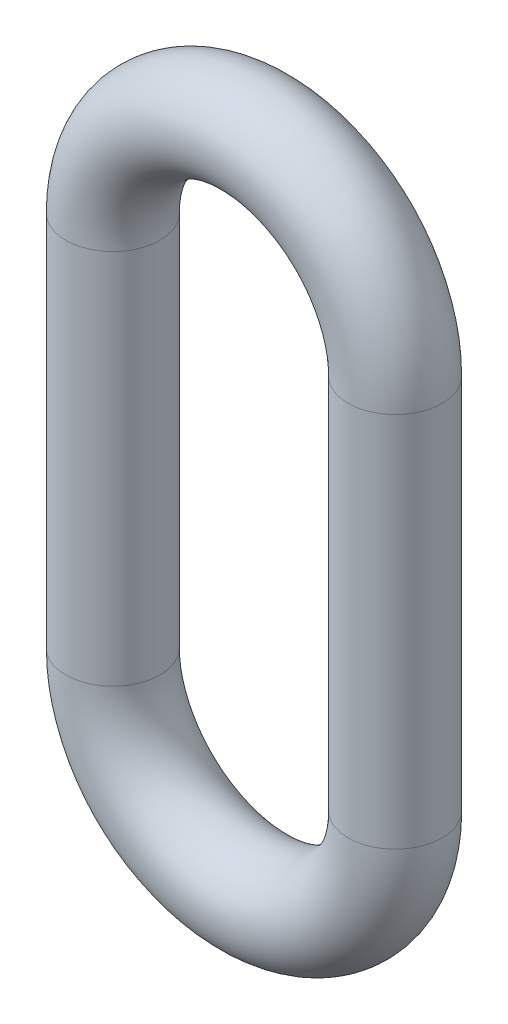
ISO-10303-21;
HEADER;
FILE_DESCRIPTION(('STEP AP214'),'2;1');
FILE_NAME('part.step','',(''),(''),'','','');
FILE_SCHEMA(('AUTOMOTIVE_DESIGN { 1 0 10303 214 1 1 1 1 }'));
ENDSEC;
DATA;
#1=APPLICATION_CONTEXT('core data for automotive mechanical design processes');
#2=APPLICATION_PROTOCOL_DEFINITION('international standard','automotive_design',2000,#1);
#3=PRODUCT_CONTEXT('',#1,'mechanical');
#4=PRODUCT('Part','Part','',(#3));
#5=PRODUCT_RELATED_PRODUCT_CATEGORY('part','',(#4));
#6=PRODUCT_DEFINITION_FORMATION('','',#4);
#7=PRODUCT_DEFINITION_CONTEXT('part definition',#1,'design');
#8=PRODUCT_DEFINITION('design','',#6,#7);
#9=PRODUCT_DEFINITION_SHAPE('','',#8);
#10=(LENGTH_UNIT() NAMED_UNIT(*) SI_UNIT(.MILLI.,.METRE.));
#11=(NAMED_UNIT(*) PLANE_ANGLE_UNIT() SI_UNIT($,.RADIAN.));
#12=(NAMED_UNIT(*) SI_UNIT($,.STERADIAN.) SOLID_ANGLE_UNIT());
#13=UNCERTAINTY_MEASURE_WITH_UNIT(LENGTH_MEASURE(1.E-05),#10,'distance_accuracy_value','');
#14=(GEOMETRIC_REPRESENTATION_CONTEXT(3) GLOBAL_UNCERTAINTY_ASSIGNED_CONTEXT((#13)) GLOBAL_UNIT_ASSIGNED_CONTEXT((#10,
#11,#12)) REPRESENTATION_CONTEXT('',''));
#15=CARTESIAN_POINT('',(0.,0.,0.));
#16=DIRECTION('',(0.,0.,1.));
#17=DIRECTION('',(1.,0.,0.));
#18=AXIS2_PLACEMENT_3D('',#15,#16,#17);
#19=CARTESIAN_POINT('',(0.,0.,0.));
#20=DIRECTION('',(0.,0.,0.999999999999999));
#21=DIRECTION('',(1.,0.,0.));
#22=AXIS2_PLACEMENT_3D('',#19,#20,#21);
#23=TOROIDAL_SURFACE('',#22,4.5,1.5);
#24=CARTESIAN_POINT('',(-4.4999999999995,-1.11022302462516E-13,-3.33066907387547E-13));
#25=DIRECTION('',(0.,1.,0.));
#26=DIRECTION('',(0.,0.,0.999999999999999));
#27=AXIS2_PLACEMENT_3D('',#24,#25,#26);
#28=CIRCLE('',#27,1.5);
#29=CARTESIAN_POINT('',(-6.,-1.48029736616704E-13,-4.44089209850112E-13));
#30=VERTEX_POINT('',#29);
#31=EDGE_CURVE('E47',#30,#30,#28,.T.);
#32=CARTESIAN_POINT('',(4.50000000000067,0.,-2.91433543964104E-13));
#33=DIRECTION('',(0.,-1.,0.));
#34=DIRECTION('',(0.,0.,0.999999999999999));
#35=AXIS2_PLACEMENT_3D('',#32,#33,#34);
#36=CIRCLE('',#35,1.5);
#37=CARTESIAN_POINT('',(6.,-1.11022302462499E-13,-3.88578058618747E-13));
#38=VERTEX_POINT('',#37);
#39=EDGE_CURVE('E43',#38,#38,#36,.T.);
#40=CARTESIAN_POINT('',(0.,0.,0.));
#41=DIRECTION('',(0.,0.,0.999999999999999));
#42=DIRECTION('',(1.,0.,0.));
#43=AXIS2_PLACEMENT_3D('',#40,#41,#42);
#44=CIRCLE('',#43,6.);
#45=EDGE_CURVE('',#30,#38,#44,.T.);
#46=ORIENTED_EDGE('',*,*,#31,.F.);
#47=ORIENTED_EDGE('',*,*,#39,.T.);
#48=ORIENTED_EDGE('',*,*,#45,.T.);
#49=ORIENTED_EDGE('',*,*,#45,.F.);
#50=EDGE_LOOP('',(#46,#48,#47,#49));
#51=FACE_BOUND('',#50,.T.);
#52=ADVANCED_FACE('F32',(#51),#23,.T.);
#53=CARTESIAN_POINT('',(4.50000000000067,0.,-2.91433543964104E-13));
#54=DIRECTION('',(0.,1.,0.));
#55=DIRECTION('',(-1.,0.,0.));
#56=AXIS2_PLACEMENT_3D('',#53,#54,#55);
#57=CYLINDRICAL_SURFACE('',#56,1.5);
#58=CARTESIAN_POINT('',(4.50000000000025,12.0000000000001,-2.77555756156289E-13));
#59=DIRECTION('',(0.,-1.,0.));
#60=DIRECTION('',(0.,0.,0.999999999999999));
#61=AXIS2_PLACEMENT_3D('',#58,#59,#60);
#62=CIRCLE('',#61,1.5);
#63=CARTESIAN_POINT('',(6.00000000000039,12.,-2.17418675655753E-13));
#64=VERTEX_POINT('',#63);
#65=EDGE_CURVE('E39',#64,#64,#62,.T.);
#66=ORIENTED_EDGE('',*,*,#65,.T.);
#67=EDGE_LOOP('',(#66));
#68=FACE_BOUND('',#67,.T.);
#69=ORIENTED_EDGE('',*,*,#39,.F.);
#70=EDGE_LOOP('',(#69));
#71=FACE_BOUND('',#70,.T.);
#72=ADVANCED_FACE('F56',(#68,#71),#57,.T.);
#73=CARTESIAN_POINT('',(3.88578058618805E-13,12.0000000000001,-4.57966997657877E-13));
#74=DIRECTION('',(0.,0.,0.999999999999999));
#75=DIRECTION('',(1.,0.,0.));
#76=AXIS2_PLACEMENT_3D('',#73,#74,#75);
#77=TOROIDAL_SURFACE('',#76,4.5,1.5);
#78=CARTESIAN_POINT('',(-4.4999999999995,12.,0.));
#79=DIRECTION('',(0.,1.,0.));
#80=DIRECTION('',(0.,0.,0.999999999999999));
#81=AXIS2_PLACEMENT_3D('',#78,#79,#80);
#82=CIRCLE('',#81,1.5);
#83=CARTESIAN_POINT('',(-5.99999999999961,11.9999999999999,0.));
#84=VERTEX_POINT('',#83);
#85=EDGE_CURVE('E10',#84,#84,#82,.T.);
#86=CARTESIAN_POINT('',(3.88578058618805E-13,12.0000000000001,-4.57966997657877E-13));
#87=DIRECTION('',(0.,0.,0.999999999999999));
#88=DIRECTION('',(1.,0.,0.));
#89=AXIS2_PLACEMENT_3D('',#86,#87,#88);
#90=CIRCLE('',#89,6.);
#91=EDGE_CURVE('',#64,#84,#90,.T.);
#92=ORIENTED_EDGE('',*,*,#65,.F.);
#93=ORIENTED_EDGE('',*,*,#85,.T.);
#94=ORIENTED_EDGE('',*,*,#91,.T.);
#95=ORIENTED_EDGE('',*,*,#91,.F.);
#96=EDGE_LOOP('',(#92,#94,#93,#95));
#97=FACE_BOUND('',#96,.T.);
#98=ADVANCED_FACE('F62',(#97),#77,.T.);
#99=CARTESIAN_POINT('',(-4.4999999999995,12.,0.));
#100=DIRECTION('',(0.,-1.,0.));
#101=DIRECTION('',(1.,0.,0.));
#102=AXIS2_PLACEMENT_3D('',#99,#100,#101);
#103=CYLINDRICAL_SURFACE('',#102,1.5);
#104=ORIENTED_EDGE('',*,*,#31,.T.);
#105=EDGE_LOOP('',(#104));
#106=FACE_BOUND('',#105,.T.);
#107=ORIENTED_EDGE('',*,*,#85,.F.);
#108=EDGE_LOOP('',(#107));
#109=FACE_BOUND('',#108,.T.);
#110=ADVANCED_FACE('F34',(#106,#109),#103,.T.);
#111=CLOSED_SHELL('',(#52,#72,#98,#110));
#112=MANIFOLD_SOLID_BREP('B2',#111);
#113=ADVANCED_BREP_SHAPE_REPRESENTATION('',(#18,#112),#14);
#114=SHAPE_DEFINITION_REPRESENTATION(#9,#113);
ENDSEC;
END-ISO-10303-21;
